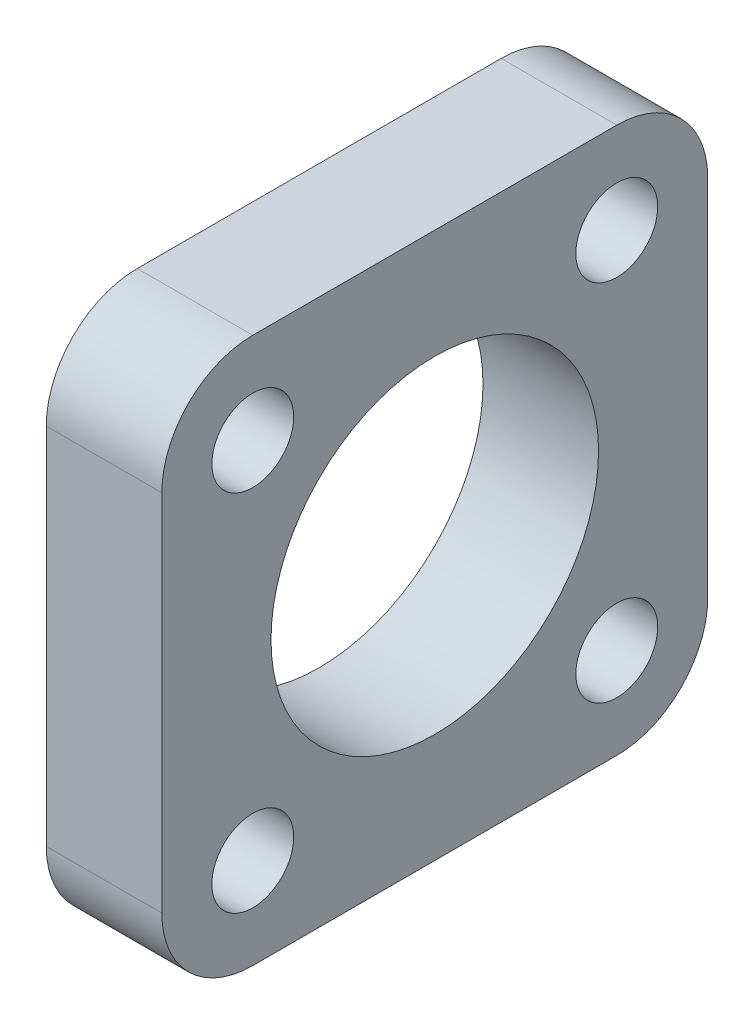
ISO-10303-21;
HEADER;
FILE_DESCRIPTION(('STEP AP214'),'2;1');
FILE_NAME('part.step','',(''),(''),'','','');
FILE_SCHEMA(('AUTOMOTIVE_DESIGN { 1 0 10303 214 1 1 1 1 }'));
ENDSEC;
DATA;
#1=APPLICATION_CONTEXT('core data for automotive mechanical design processes');
#2=APPLICATION_PROTOCOL_DEFINITION('international standard','automotive_design',2000,#1);
#3=PRODUCT_CONTEXT('',#1,'mechanical');
#4=PRODUCT('Part','Part','',(#3));
#5=PRODUCT_RELATED_PRODUCT_CATEGORY('part','',(#4));
#6=PRODUCT_DEFINITION_FORMATION('','',#4);
#7=PRODUCT_DEFINITION_CONTEXT('part definition',#1,'design');
#8=PRODUCT_DEFINITION('design','',#6,#7);
#9=PRODUCT_DEFINITION_SHAPE('','',#8);
#10=(LENGTH_UNIT() NAMED_UNIT(*) SI_UNIT(.MILLI.,.METRE.));
#11=(NAMED_UNIT(*) PLANE_ANGLE_UNIT() SI_UNIT($,.RADIAN.));
#12=(NAMED_UNIT(*) SI_UNIT($,.STERADIAN.) SOLID_ANGLE_UNIT());
#13=UNCERTAINTY_MEASURE_WITH_UNIT(LENGTH_MEASURE(1.E-05),#10,'distance_accuracy_value','');
#14=(GEOMETRIC_REPRESENTATION_CONTEXT(3) GLOBAL_UNCERTAINTY_ASSIGNED_CONTEXT((#13)) GLOBAL_UNIT_ASSIGNED_CONTEXT((#10,
#11,#12)) REPRESENTATION_CONTEXT('',''));
#15=CARTESIAN_POINT('',(0.,0.,0.));
#16=DIRECTION('',(0.,0.,1.));
#17=DIRECTION('',(1.,0.,0.));
#18=AXIS2_PLACEMENT_3D('',#15,#16,#17);
#19=CARTESIAN_POINT('',(3.175,0.,0.));
#20=DIRECTION('',(-1.,0.,0.));
#21=DIRECTION('',(0.,0.,1.));
#22=AXIS2_PLACEMENT_3D('',#19,#20,#21);
#23=PLANE('',#22);
#24=DIRECTION('',(0.,0.,-1.));
#25=VECTOR('',#24,1.);
#26=CARTESIAN_POINT('',(3.175,-15.,15.));
#27=LINE('',#26,#25);
#28=CARTESIAN_POINT('',(3.175,-15.,10.));
#29=VERTEX_POINT('',#28);
#30=CARTESIAN_POINT('',(3.175,-15.,-10.));
#31=VERTEX_POINT('',#30);
#32=EDGE_CURVE('E138',#29,#31,#27,.T.);
#33=ORIENTED_EDGE('',*,*,#32,.T.);
#34=CARTESIAN_POINT('',(3.175,-10.,-9.99999999999999));
#35=DIRECTION('',(-1.,0.,0.));
#36=DIRECTION('',(0.,0.,1.));
#37=AXIS2_PLACEMENT_3D('',#34,#35,#36);
#38=CIRCLE('',#37,5.);
#39=CARTESIAN_POINT('',(3.175,-10.,-15.));
#40=VERTEX_POINT('',#39);
#41=EDGE_CURVE('E156',#31,#40,#38,.F.);
#42=ORIENTED_EDGE('',*,*,#41,.T.);
#43=DIRECTION('',(0.,1.,0.));
#44=VECTOR('',#43,1.);
#45=CARTESIAN_POINT('',(3.175,-15.,-15.));
#46=LINE('',#45,#44);
#47=CARTESIAN_POINT('',(3.175,10.,-15.));
#48=VERTEX_POINT('',#47);
#49=EDGE_CURVE('E120',#40,#48,#46,.T.);
#50=ORIENTED_EDGE('',*,*,#49,.T.);
#51=CARTESIAN_POINT('',(3.175,10.,-10.));
#52=DIRECTION('',(-1.,0.,0.));
#53=DIRECTION('',(0.,0.,1.));
#54=AXIS2_PLACEMENT_3D('',#51,#52,#53);
#55=CIRCLE('',#54,5.);
#56=CARTESIAN_POINT('',(3.175,15.,-10.));
#57=VERTEX_POINT('',#56);
#58=EDGE_CURVE('E152',#48,#57,#55,.F.);
#59=ORIENTED_EDGE('',*,*,#58,.T.);
#60=DIRECTION('',(0.,0.,1.));
#61=VECTOR('',#60,1.);
#62=CARTESIAN_POINT('',(3.175,15.,15.));
#63=LINE('',#62,#61);
#64=CARTESIAN_POINT('',(3.175,15.,10.));
#65=VERTEX_POINT('',#64);
#66=EDGE_CURVE('E165',#57,#65,#63,.T.);
#67=ORIENTED_EDGE('',*,*,#66,.T.);
#68=CARTESIAN_POINT('',(3.175,10.,10.));
#69=DIRECTION('',(-1.,0.,0.));
#70=DIRECTION('',(0.,0.,1.));
#71=AXIS2_PLACEMENT_3D('',#68,#69,#70);
#72=CIRCLE('',#71,5.);
#73=CARTESIAN_POINT('',(3.175,10.,15.));
#74=VERTEX_POINT('',#73);
#75=EDGE_CURVE('E55',#65,#74,#72,.F.);
#76=ORIENTED_EDGE('',*,*,#75,.T.);
#77=DIRECTION('',(0.,-1.,0.));
#78=VECTOR('',#77,1.);
#79=CARTESIAN_POINT('',(3.175,-15.,15.));
#80=LINE('',#79,#78);
#81=CARTESIAN_POINT('',(3.175,-10.,15.));
#82=VERTEX_POINT('',#81);
#83=EDGE_CURVE('E171',#74,#82,#80,.T.);
#84=ORIENTED_EDGE('',*,*,#83,.T.);
#85=CARTESIAN_POINT('',(3.175,-10.,10.));
#86=DIRECTION('',(-1.,0.,0.));
#87=DIRECTION('',(0.,0.,1.));
#88=AXIS2_PLACEMENT_3D('',#85,#86,#87);
#89=CIRCLE('',#88,5.);
#90=EDGE_CURVE('E154',#82,#29,#89,.F.);
#91=ORIENTED_EDGE('',*,*,#90,.T.);
#92=EDGE_LOOP('',(#33,#42,#50,#59,#67,#76,#84,#91));
#93=FACE_BOUND('',#92,.T.);
#94=CARTESIAN_POINT('',(3.175,0.,0.));
#95=DIRECTION('',(1.,0.,0.));
#96=DIRECTION('',(0.,0.,-1.));
#97=AXIS2_PLACEMENT_3D('',#94,#95,#96);
#98=CIRCLE('',#97,9.);
#99=CARTESIAN_POINT('',(3.175,0.,-9.));
#100=VERTEX_POINT('',#99);
#101=EDGE_CURVE('E129',#100,#100,#98,.T.);
#102=ORIENTED_EDGE('',*,*,#101,.F.);
#103=EDGE_LOOP('',(#102));
#104=FACE_BOUND('',#103,.T.);
#105=CARTESIAN_POINT('',(3.175,10.,-10.));
#106=DIRECTION('',(1.,0.,0.));
#107=DIRECTION('',(0.,0.,-1.));
#108=AXIS2_PLACEMENT_3D('',#105,#106,#107);
#109=CIRCLE('',#108,2.25);
#110=CARTESIAN_POINT('',(3.175,10.,-12.25));
#111=VERTEX_POINT('',#110);
#112=EDGE_CURVE('E190',#111,#111,#109,.T.);
#113=ORIENTED_EDGE('',*,*,#112,.F.);
#114=EDGE_LOOP('',(#113));
#115=FACE_BOUND('',#114,.T.);
#116=CARTESIAN_POINT('',(3.175,-10.,-10.));
#117=DIRECTION('',(1.,0.,0.));
#118=DIRECTION('',(0.,0.,-1.));
#119=AXIS2_PLACEMENT_3D('',#116,#117,#118);
#120=CIRCLE('',#119,2.25);
#121=CARTESIAN_POINT('',(3.175,-10.,-12.25));
#122=VERTEX_POINT('',#121);
#123=EDGE_CURVE('E196',#122,#122,#120,.T.);
#124=ORIENTED_EDGE('',*,*,#123,.F.);
#125=EDGE_LOOP('',(#124));
#126=FACE_BOUND('',#125,.T.);
#127=CARTESIAN_POINT('',(3.175,-10.,9.99999999999999));
#128=DIRECTION('',(1.,0.,0.));
#129=DIRECTION('',(0.,0.,-1.));
#130=AXIS2_PLACEMENT_3D('',#127,#128,#129);
#131=CIRCLE('',#130,2.25);
#132=CARTESIAN_POINT('',(3.175,-10.,7.75));
#133=VERTEX_POINT('',#132);
#134=EDGE_CURVE('E202',#133,#133,#131,.T.);
#135=ORIENTED_EDGE('',*,*,#134,.F.);
#136=EDGE_LOOP('',(#135));
#137=FACE_BOUND('',#136,.T.);
#138=CARTESIAN_POINT('',(3.175,10.,10.));
#139=DIRECTION('',(1.,0.,0.));
#140=DIRECTION('',(0.,0.,-1.));
#141=AXIS2_PLACEMENT_3D('',#138,#139,#140);
#142=CIRCLE('',#141,2.25);
#143=CARTESIAN_POINT('',(3.175,10.,7.75));
#144=VERTEX_POINT('',#143);
#145=EDGE_CURVE('E208',#144,#144,#142,.T.);
#146=ORIENTED_EDGE('',*,*,#145,.F.);
#147=EDGE_LOOP('',(#146));
#148=FACE_BOUND('',#147,.T.);
#149=ADVANCED_FACE('F33',(#93,#104,#115,#126,#137,#148),#23,.F.);
#150=CARTESIAN_POINT('',(-3.175,0.,0.));
#151=DIRECTION('',(-1.,0.,0.));
#152=DIRECTION('',(0.,0.,1.));
#153=AXIS2_PLACEMENT_3D('',#150,#151,#152);
#154=PLANE('',#153);
#155=CARTESIAN_POINT('',(-3.175,10.,10.));
#156=DIRECTION('',(-1.,0.,0.));
#157=DIRECTION('',(0.,0.,1.));
#158=AXIS2_PLACEMENT_3D('',#155,#156,#157);
#159=CIRCLE('',#158,2.25);
#160=CARTESIAN_POINT('',(-3.175,10.,12.25));
#161=VERTEX_POINT('',#160);
#162=EDGE_CURVE('E205',#161,#161,#159,.T.);
#163=ORIENTED_EDGE('',*,*,#162,.F.);
#164=EDGE_LOOP('',(#163));
#165=FACE_BOUND('',#164,.T.);
#166=CARTESIAN_POINT('',(-3.175,-10.,9.99999999999999));
#167=DIRECTION('',(-1.,0.,0.));
#168=DIRECTION('',(0.,0.,1.));
#169=AXIS2_PLACEMENT_3D('',#166,#167,#168);
#170=CIRCLE('',#169,2.25);
#171=CARTESIAN_POINT('',(-3.175,-10.,12.25));
#172=VERTEX_POINT('',#171);
#173=EDGE_CURVE('E199',#172,#172,#170,.T.);
#174=ORIENTED_EDGE('',*,*,#173,.F.);
#175=EDGE_LOOP('',(#174));
#176=FACE_BOUND('',#175,.T.);
#177=CARTESIAN_POINT('',(-3.175,-10.,-10.));
#178=DIRECTION('',(-1.,0.,0.));
#179=DIRECTION('',(0.,0.,1.));
#180=AXIS2_PLACEMENT_3D('',#177,#178,#179);
#181=CIRCLE('',#180,2.25);
#182=CARTESIAN_POINT('',(-3.175,-10.,-7.75));
#183=VERTEX_POINT('',#182);
#184=EDGE_CURVE('E193',#183,#183,#181,.T.);
#185=ORIENTED_EDGE('',*,*,#184,.F.);
#186=EDGE_LOOP('',(#185));
#187=FACE_BOUND('',#186,.T.);
#188=CARTESIAN_POINT('',(-3.175,10.,-10.));
#189=DIRECTION('',(-1.,0.,0.));
#190=DIRECTION('',(0.,0.,1.));
#191=AXIS2_PLACEMENT_3D('',#188,#189,#190);
#192=CIRCLE('',#191,2.25);
#193=CARTESIAN_POINT('',(-3.175,10.,-7.75));
#194=VERTEX_POINT('',#193);
#195=EDGE_CURVE('E186',#194,#194,#192,.T.);
#196=ORIENTED_EDGE('',*,*,#195,.F.);
#197=EDGE_LOOP('',(#196));
#198=FACE_BOUND('',#197,.T.);
#199=DIRECTION('',(0.,1.,0.));
#200=VECTOR('',#199,1.);
#201=CARTESIAN_POINT('',(-3.175,-15.,-15.));
#202=LINE('',#201,#200);
#203=CARTESIAN_POINT('',(-3.175,-10.,-15.));
#204=VERTEX_POINT('',#203);
#205=CARTESIAN_POINT('',(-3.175,10.,-15.));
#206=VERTEX_POINT('',#205);
#207=EDGE_CURVE('E117',#204,#206,#202,.T.);
#208=ORIENTED_EDGE('',*,*,#207,.F.);
#209=CARTESIAN_POINT('',(-3.175,-10.,-9.99999999999999));
#210=DIRECTION('',(-1.,0.,0.));
#211=DIRECTION('',(0.,0.,1.));
#212=AXIS2_PLACEMENT_3D('',#209,#210,#211);
#213=CIRCLE('',#212,5.);
#214=CARTESIAN_POINT('',(-3.175,-15.,-10.));
#215=VERTEX_POINT('',#214);
#216=EDGE_CURVE('E100',#204,#215,#213,.T.);
#217=ORIENTED_EDGE('',*,*,#216,.T.);
#218=DIRECTION('',(0.,0.,-1.));
#219=VECTOR('',#218,1.);
#220=CARTESIAN_POINT('',(-3.175,-15.,15.));
#221=LINE('',#220,#219);
#222=CARTESIAN_POINT('',(-3.175,-15.,10.));
#223=VERTEX_POINT('',#222);
#224=EDGE_CURVE('E142',#223,#215,#221,.T.);
#225=ORIENTED_EDGE('',*,*,#224,.F.);
#226=CARTESIAN_POINT('',(-3.175,-10.,10.));
#227=DIRECTION('',(-1.,0.,0.));
#228=DIRECTION('',(0.,0.,1.));
#229=AXIS2_PLACEMENT_3D('',#226,#227,#228);
#230=CIRCLE('',#229,5.);
#231=CARTESIAN_POINT('',(-3.175,-10.,15.));
#232=VERTEX_POINT('',#231);
#233=EDGE_CURVE('E111',#223,#232,#230,.T.);
#234=ORIENTED_EDGE('',*,*,#233,.T.);
#235=DIRECTION('',(0.,-1.,0.));
#236=VECTOR('',#235,1.);
#237=CARTESIAN_POINT('',(-3.175,-15.,15.));
#238=LINE('',#237,#236);
#239=CARTESIAN_POINT('',(-3.175,10.,15.));
#240=VERTEX_POINT('',#239);
#241=EDGE_CURVE('E132',#240,#232,#238,.T.);
#242=ORIENTED_EDGE('',*,*,#241,.F.);
#243=CARTESIAN_POINT('',(-3.175,10.,10.));
#244=DIRECTION('',(-1.,0.,0.));
#245=DIRECTION('',(0.,0.,1.));
#246=AXIS2_PLACEMENT_3D('',#243,#244,#245);
#247=CIRCLE('',#246,5.);
#248=CARTESIAN_POINT('',(-3.175,15.,10.));
#249=VERTEX_POINT('',#248);
#250=EDGE_CURVE('E121',#240,#249,#247,.T.);
#251=ORIENTED_EDGE('',*,*,#250,.T.);
#252=DIRECTION('',(0.,0.,1.));
#253=VECTOR('',#252,1.);
#254=CARTESIAN_POINT('',(-3.175,15.,15.));
#255=LINE('',#254,#253);
#256=CARTESIAN_POINT('',(-3.175,15.,-10.));
#257=VERTEX_POINT('',#256);
#258=EDGE_CURVE('E128',#257,#249,#255,.T.);
#259=ORIENTED_EDGE('',*,*,#258,.F.);
#260=CARTESIAN_POINT('',(-3.175,10.,-10.));
#261=DIRECTION('',(-1.,0.,0.));
#262=DIRECTION('',(0.,0.,1.));
#263=AXIS2_PLACEMENT_3D('',#260,#261,#262);
#264=CIRCLE('',#263,5.);
#265=EDGE_CURVE('E127',#257,#206,#264,.T.);
#266=ORIENTED_EDGE('',*,*,#265,.T.);
#267=EDGE_LOOP('',(#208,#217,#225,#234,#242,#251,#259,#266));
#268=FACE_BOUND('',#267,.T.);
#269=CARTESIAN_POINT('',(-3.175,0.,0.));
#270=DIRECTION('',(1.,0.,0.));
#271=DIRECTION('',(0.,0.,-1.));
#272=AXIS2_PLACEMENT_3D('',#269,#270,#271);
#273=CIRCLE('',#272,9.);
#274=CARTESIAN_POINT('',(-3.175,0.,-9.));
#275=VERTEX_POINT('',#274);
#276=EDGE_CURVE('E135',#275,#275,#273,.T.);
#277=ORIENTED_EDGE('',*,*,#276,.T.);
#278=EDGE_LOOP('',(#277));
#279=FACE_BOUND('',#278,.T.);
#280=ADVANCED_FACE('F124',(#165,#176,#187,#198,#268,#279),#154,.T.);
#281=CARTESIAN_POINT('',(3.175,-15.,-15.));
#282=DIRECTION('',(0.,0.,1.));
#283=DIRECTION('',(1.,0.,0.));
#284=AXIS2_PLACEMENT_3D('',#281,#282,#283);
#285=PLANE('',#284);
#286=ORIENTED_EDGE('',*,*,#49,.F.);
#287=DIRECTION('',(-1.,0.,0.));
#288=VECTOR('',#287,1.);
#289=CARTESIAN_POINT('',(3.175,-10.,-15.));
#290=LINE('',#289,#288);
#291=EDGE_CURVE('E104',#40,#204,#290,.T.);
#292=ORIENTED_EDGE('',*,*,#291,.T.);
#293=ORIENTED_EDGE('',*,*,#207,.T.);
#294=DIRECTION('',(-1.,0.,0.));
#295=VECTOR('',#294,1.);
#296=CARTESIAN_POINT('',(3.175,10.,-15.));
#297=LINE('',#296,#295);
#298=EDGE_CURVE('E122',#206,#48,#297,.F.);
#299=ORIENTED_EDGE('',*,*,#298,.T.);
#300=EDGE_LOOP('',(#286,#292,#293,#299));
#301=FACE_BOUND('',#300,.T.);
#302=ADVANCED_FACE('F116',(#301),#285,.F.);
#303=CARTESIAN_POINT('',(3.175,15.,15.));
#304=DIRECTION('',(0.,-1.,0.));
#305=DIRECTION('',(0.,0.,-1.));
#306=AXIS2_PLACEMENT_3D('',#303,#304,#305);
#307=PLANE('',#306);
#308=ORIENTED_EDGE('',*,*,#66,.F.);
#309=DIRECTION('',(-1.,0.,0.));
#310=VECTOR('',#309,1.);
#311=CARTESIAN_POINT('',(3.175,15.,-10.));
#312=LINE('',#311,#310);
#313=EDGE_CURVE('E11',#57,#257,#312,.T.);
#314=ORIENTED_EDGE('',*,*,#313,.T.);
#315=ORIENTED_EDGE('',*,*,#258,.T.);
#316=DIRECTION('',(-1.,0.,0.));
#317=VECTOR('',#316,1.);
#318=CARTESIAN_POINT('',(3.175,15.,10.));
#319=LINE('',#318,#317);
#320=EDGE_CURVE('E41',#249,#65,#319,.F.);
#321=ORIENTED_EDGE('',*,*,#320,.T.);
#322=EDGE_LOOP('',(#308,#314,#315,#321));
#323=FACE_BOUND('',#322,.T.);
#324=ADVANCED_FACE('F164',(#323),#307,.F.);
#325=CARTESIAN_POINT('',(3.175,-15.,15.));
#326=DIRECTION('',(0.,0.,-1.));
#327=DIRECTION('',(-1.,0.,0.));
#328=AXIS2_PLACEMENT_3D('',#325,#326,#327);
#329=PLANE('',#328);
#330=ORIENTED_EDGE('',*,*,#241,.T.);
#331=DIRECTION('',(-1.,0.,0.));
#332=VECTOR('',#331,1.);
#333=CARTESIAN_POINT('',(3.175,-10.,15.));
#334=LINE('',#333,#332);
#335=EDGE_CURVE('E48',#232,#82,#334,.F.);
#336=ORIENTED_EDGE('',*,*,#335,.T.);
#337=ORIENTED_EDGE('',*,*,#83,.F.);
#338=DIRECTION('',(-1.,0.,0.));
#339=VECTOR('',#338,1.);
#340=CARTESIAN_POINT('',(3.175,10.,15.));
#341=LINE('',#340,#339);
#342=EDGE_CURVE('E158',#74,#240,#341,.T.);
#343=ORIENTED_EDGE('',*,*,#342,.T.);
#344=EDGE_LOOP('',(#330,#336,#337,#343));
#345=FACE_BOUND('',#344,.T.);
#346=ADVANCED_FACE('F175',(#345),#329,.F.);
#347=CARTESIAN_POINT('',(3.175,-15.,15.));
#348=DIRECTION('',(0.,1.,0.));
#349=DIRECTION('',(0.,0.,1.));
#350=AXIS2_PLACEMENT_3D('',#347,#348,#349);
#351=PLANE('',#350);
#352=ORIENTED_EDGE('',*,*,#224,.T.);
#353=DIRECTION('',(-1.,0.,0.));
#354=VECTOR('',#353,1.);
#355=CARTESIAN_POINT('',(3.175,-15.,-10.));
#356=LINE('',#355,#354);
#357=EDGE_CURVE('E105',#215,#31,#356,.F.);
#358=ORIENTED_EDGE('',*,*,#357,.T.);
#359=ORIENTED_EDGE('',*,*,#32,.F.);
#360=DIRECTION('',(-1.,0.,0.));
#361=VECTOR('',#360,1.);
#362=CARTESIAN_POINT('',(3.175,-15.,10.));
#363=LINE('',#362,#361);
#364=EDGE_CURVE('E110',#29,#223,#363,.T.);
#365=ORIENTED_EDGE('',*,*,#364,.T.);
#366=EDGE_LOOP('',(#352,#358,#359,#365));
#367=FACE_BOUND('',#366,.T.);
#368=ADVANCED_FACE('F182',(#367),#351,.F.);
#369=CARTESIAN_POINT('',(3.175,0.,0.));
#370=DIRECTION('',(-1.,0.,0.));
#371=DIRECTION('',(0.,0.,1.));
#372=AXIS2_PLACEMENT_3D('',#369,#370,#371);
#373=CYLINDRICAL_SURFACE('',#372,9.);
#374=ORIENTED_EDGE('',*,*,#101,.T.);
#375=EDGE_LOOP('',(#374));
#376=FACE_BOUND('',#375,.T.);
#377=ORIENTED_EDGE('',*,*,#276,.F.);
#378=EDGE_LOOP('',(#377));
#379=FACE_BOUND('',#378,.T.);
#380=ADVANCED_FACE('F223',(#376,#379),#373,.F.);
#381=CARTESIAN_POINT('',(3.175,10.,-10.));
#382=DIRECTION('',(1.,0.,0.));
#383=DIRECTION('',(0.,0.,-1.));
#384=AXIS2_PLACEMENT_3D('',#381,#382,#383);
#385=CYLINDRICAL_SURFACE('',#384,2.25);
#386=ORIENTED_EDGE('',*,*,#112,.T.);
#387=EDGE_LOOP('',(#386));
#388=FACE_BOUND('',#387,.T.);
#389=ORIENTED_EDGE('',*,*,#195,.T.);
#390=EDGE_LOOP('',(#389));
#391=FACE_BOUND('',#390,.T.);
#392=ADVANCED_FACE('F326',(#388,#391),#385,.F.);
#393=CARTESIAN_POINT('',(3.175,-10.,-10.));
#394=DIRECTION('',(1.,0.,0.));
#395=DIRECTION('',(0.,0.,-1.));
#396=AXIS2_PLACEMENT_3D('',#393,#394,#395);
#397=CYLINDRICAL_SURFACE('',#396,2.25);
#398=ORIENTED_EDGE('',*,*,#123,.T.);
#399=EDGE_LOOP('',(#398));
#400=FACE_BOUND('',#399,.T.);
#401=ORIENTED_EDGE('',*,*,#184,.T.);
#402=EDGE_LOOP('',(#401));
#403=FACE_BOUND('',#402,.T.);
#404=ADVANCED_FACE('F316',(#400,#403),#397,.F.);
#405=CARTESIAN_POINT('',(3.175,-10.,9.99999999999999));
#406=DIRECTION('',(1.,0.,0.));
#407=DIRECTION('',(0.,0.,-1.));
#408=AXIS2_PLACEMENT_3D('',#405,#406,#407);
#409=CYLINDRICAL_SURFACE('',#408,2.25);
#410=ORIENTED_EDGE('',*,*,#134,.T.);
#411=EDGE_LOOP('',(#410));
#412=FACE_BOUND('',#411,.T.);
#413=ORIENTED_EDGE('',*,*,#173,.T.);
#414=EDGE_LOOP('',(#413));
#415=FACE_BOUND('',#414,.T.);
#416=ADVANCED_FACE('F307',(#412,#415),#409,.F.);
#417=CARTESIAN_POINT('',(3.175,10.,10.));
#418=DIRECTION('',(1.,0.,0.));
#419=DIRECTION('',(0.,0.,-1.));
#420=AXIS2_PLACEMENT_3D('',#417,#418,#419);
#421=CYLINDRICAL_SURFACE('',#420,2.25);
#422=ORIENTED_EDGE('',*,*,#145,.T.);
#423=EDGE_LOOP('',(#422));
#424=FACE_BOUND('',#423,.T.);
#425=ORIENTED_EDGE('',*,*,#162,.T.);
#426=EDGE_LOOP('',(#425));
#427=FACE_BOUND('',#426,.T.);
#428=ADVANCED_FACE('F212',(#424,#427),#421,.F.);
#429=CARTESIAN_POINT('',(3.175,-10.,-9.99999999999999));
#430=DIRECTION('',(-1.,0.,0.));
#431=DIRECTION('',(0.,0.,1.));
#432=AXIS2_PLACEMENT_3D('',#429,#430,#431);
#433=CYLINDRICAL_SURFACE('',#432,5.);
#434=ORIENTED_EDGE('',*,*,#41,.F.);
#435=ORIENTED_EDGE('',*,*,#357,.F.);
#436=ORIENTED_EDGE('',*,*,#216,.F.);
#437=ORIENTED_EDGE('',*,*,#291,.F.);
#438=EDGE_LOOP('',(#434,#435,#436,#437));
#439=FACE_BOUND('',#438,.T.);
#440=ADVANCED_FACE('F103',(#439),#433,.T.);
#441=CARTESIAN_POINT('',(3.175,-10.,10.));
#442=DIRECTION('',(-1.,0.,0.));
#443=DIRECTION('',(0.,0.,1.));
#444=AXIS2_PLACEMENT_3D('',#441,#442,#443);
#445=CYLINDRICAL_SURFACE('',#444,5.);
#446=ORIENTED_EDGE('',*,*,#90,.F.);
#447=ORIENTED_EDGE('',*,*,#335,.F.);
#448=ORIENTED_EDGE('',*,*,#233,.F.);
#449=ORIENTED_EDGE('',*,*,#364,.F.);
#450=EDGE_LOOP('',(#446,#447,#448,#449));
#451=FACE_BOUND('',#450,.T.);
#452=ADVANCED_FACE('F179',(#451),#445,.T.);
#453=CARTESIAN_POINT('',(3.175,10.,-10.));
#454=DIRECTION('',(-1.,0.,0.));
#455=DIRECTION('',(0.,0.,1.));
#456=AXIS2_PLACEMENT_3D('',#453,#454,#455);
#457=CYLINDRICAL_SURFACE('',#456,5.);
#458=ORIENTED_EDGE('',*,*,#58,.F.);
#459=ORIENTED_EDGE('',*,*,#298,.F.);
#460=ORIENTED_EDGE('',*,*,#265,.F.);
#461=ORIENTED_EDGE('',*,*,#313,.F.);
#462=EDGE_LOOP('',(#458,#459,#460,#461));
#463=FACE_BOUND('',#462,.T.);
#464=ADVANCED_FACE('F237',(#463),#457,.T.);
#465=CARTESIAN_POINT('',(3.175,10.,10.));
#466=DIRECTION('',(-1.,0.,0.));
#467=DIRECTION('',(0.,0.,1.));
#468=AXIS2_PLACEMENT_3D('',#465,#466,#467);
#469=CYLINDRICAL_SURFACE('',#468,5.);
#470=ORIENTED_EDGE('',*,*,#75,.F.);
#471=ORIENTED_EDGE('',*,*,#320,.F.);
#472=ORIENTED_EDGE('',*,*,#250,.F.);
#473=ORIENTED_EDGE('',*,*,#342,.F.);
#474=EDGE_LOOP('',(#470,#471,#472,#473));
#475=FACE_BOUND('',#474,.T.);
#476=ADVANCED_FACE('F35',(#475),#469,.T.);
#477=CLOSED_SHELL('',(#149,#280,#302,#324,#346,#368,#380,#392,#404,#416,#428,#440,#452,#464,#476));
#478=MANIFOLD_SOLID_BREP('B2',#477);
#479=ADVANCED_BREP_SHAPE_REPRESENTATION('',(#18,#478),#14);
#480=SHAPE_DEFINITION_REPRESENTATION(#9,#479);
ENDSEC;
END-ISO-10303-21;
